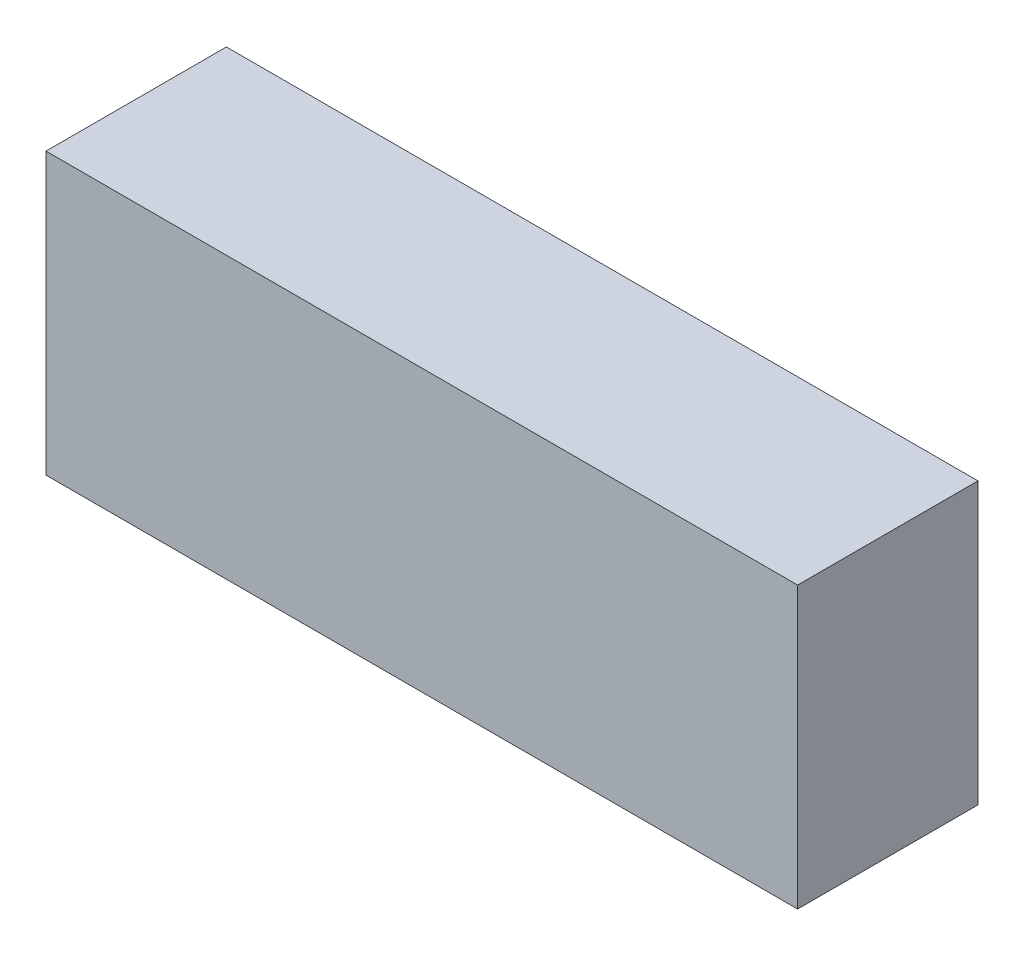
ISO-10303-21;
HEADER;
FILE_DESCRIPTION(('STEP AP214'),'2;1');
FILE_NAME('part.step','',(''),(''),'','','');
FILE_SCHEMA(('AUTOMOTIVE_DESIGN { 1 0 10303 214 1 1 1 1 }'));
ENDSEC;
DATA;
#1=APPLICATION_CONTEXT('core data for automotive mechanical design processes');
#2=APPLICATION_PROTOCOL_DEFINITION('international standard','automotive_design',2000,#1);
#3=PRODUCT_CONTEXT('',#1,'mechanical');
#4=PRODUCT('Part','Part','',(#3));
#5=PRODUCT_RELATED_PRODUCT_CATEGORY('part','',(#4));
#6=PRODUCT_DEFINITION_FORMATION('','',#4);
#7=PRODUCT_DEFINITION_CONTEXT('part definition',#1,'design');
#8=PRODUCT_DEFINITION('design','',#6,#7);
#9=PRODUCT_DEFINITION_SHAPE('','',#8);
#10=(LENGTH_UNIT() NAMED_UNIT(*) SI_UNIT(.MILLI.,.METRE.));
#11=(NAMED_UNIT(*) PLANE_ANGLE_UNIT() SI_UNIT($,.RADIAN.));
#12=(NAMED_UNIT(*) SI_UNIT($,.STERADIAN.) SOLID_ANGLE_UNIT());
#13=UNCERTAINTY_MEASURE_WITH_UNIT(LENGTH_MEASURE(1.E-05),#10,'distance_accuracy_value','');
#14=(GEOMETRIC_REPRESENTATION_CONTEXT(3) GLOBAL_UNCERTAINTY_ASSIGNED_CONTEXT((#13)) GLOBAL_UNIT_ASSIGNED_CONTEXT((#10,
#11,#12)) REPRESENTATION_CONTEXT('',''));
#15=CARTESIAN_POINT('',(0.,0.,0.));
#16=DIRECTION('',(0.,0.,1.));
#17=DIRECTION('',(1.,0.,0.));
#18=AXIS2_PLACEMENT_3D('',#15,#16,#17);
#19=CARTESIAN_POINT('',(-37.5,28.,9.00000000000001));
#20=DIRECTION('',(1.,0.,0.));
#21=DIRECTION('',(0.,0.,-1.));
#22=AXIS2_PLACEMENT_3D('',#19,#20,#21);
#23=PLANE('',#22);
#24=DIRECTION('',(0.,0.,1.));
#25=VECTOR('',#24,1.);
#26=CARTESIAN_POINT('',(-37.5,0.,9.00000000000001));
#27=LINE('',#26,#25);
#28=CARTESIAN_POINT('',(-37.5,0.,-8.99999999999999));
#29=VERTEX_POINT('',#28);
#30=CARTESIAN_POINT('',(-37.5,0.,9.00000000000001));
#31=VERTEX_POINT('',#30);
#32=EDGE_CURVE('E98',#29,#31,#27,.T.);
#33=ORIENTED_EDGE('',*,*,#32,.T.);
#34=DIRECTION('',(0.,-1.,0.));
#35=VECTOR('',#34,1.);
#36=CARTESIAN_POINT('',(-37.5,28.,9.00000000000001));
#37=LINE('',#36,#35);
#38=CARTESIAN_POINT('',(-37.5,28.,9.00000000000001));
#39=VERTEX_POINT('',#38);
#40=EDGE_CURVE('E11',#39,#31,#37,.T.);
#41=ORIENTED_EDGE('',*,*,#40,.F.);
#42=DIRECTION('',(0.,0.,1.));
#43=VECTOR('',#42,1.);
#44=CARTESIAN_POINT('',(-37.5,28.,9.00000000000001));
#45=LINE('',#44,#43);
#46=CARTESIAN_POINT('',(-37.5,28.,-8.99999999999999));
#47=VERTEX_POINT('',#46);
#48=EDGE_CURVE('E86',#47,#39,#45,.T.);
#49=ORIENTED_EDGE('',*,*,#48,.F.);
#50=DIRECTION('',(0.,-1.,0.));
#51=VECTOR('',#50,1.);
#52=CARTESIAN_POINT('',(-37.5,28.,-8.99999999999999));
#53=LINE('',#52,#51);
#54=EDGE_CURVE('E94',#47,#29,#53,.T.);
#55=ORIENTED_EDGE('',*,*,#54,.T.);
#56=EDGE_LOOP('',(#33,#41,#49,#55));
#57=FACE_BOUND('',#56,.T.);
#58=ADVANCED_FACE('F35',(#57),#23,.F.);
#59=CARTESIAN_POINT('',(37.5,28.,9.));
#60=DIRECTION('',(0.,0.,-1.));
#61=DIRECTION('',(-1.,0.,0.));
#62=AXIS2_PLACEMENT_3D('',#59,#60,#61);
#63=PLANE('',#62);
#64=DIRECTION('',(1.,0.,0.));
#65=VECTOR('',#64,1.);
#66=CARTESIAN_POINT('',(37.5,0.,9.));
#67=LINE('',#66,#65);
#68=CARTESIAN_POINT('',(37.5,0.,9.));
#69=VERTEX_POINT('',#68);
#70=EDGE_CURVE('E90',#31,#69,#67,.T.);
#71=ORIENTED_EDGE('',*,*,#70,.T.);
#72=DIRECTION('',(0.,-1.,0.));
#73=VECTOR('',#72,1.);
#74=CARTESIAN_POINT('',(37.5,28.,9.));
#75=LINE('',#74,#73);
#76=CARTESIAN_POINT('',(37.5,28.,9.));
#77=VERTEX_POINT('',#76);
#78=EDGE_CURVE('E43',#77,#69,#75,.T.);
#79=ORIENTED_EDGE('',*,*,#78,.F.);
#80=DIRECTION('',(1.,0.,0.));
#81=VECTOR('',#80,1.);
#82=CARTESIAN_POINT('',(37.5,28.,9.));
#83=LINE('',#82,#81);
#84=EDGE_CURVE('E81',#39,#77,#83,.T.);
#85=ORIENTED_EDGE('',*,*,#84,.F.);
#86=ORIENTED_EDGE('',*,*,#40,.T.);
#87=EDGE_LOOP('',(#71,#79,#85,#86));
#88=FACE_BOUND('',#87,.T.);
#89=ADVANCED_FACE('F89',(#88),#63,.F.);
#90=CARTESIAN_POINT('',(37.5,28.,9.));
#91=DIRECTION('',(-1.,0.,0.));
#92=DIRECTION('',(0.,0.,1.));
#93=AXIS2_PLACEMENT_3D('',#90,#91,#92);
#94=PLANE('',#93);
#95=DIRECTION('',(0.,0.,-1.));
#96=VECTOR('',#95,1.);
#97=CARTESIAN_POINT('',(37.5,0.,9.));
#98=LINE('',#97,#96);
#99=CARTESIAN_POINT('',(37.5,0.,-9.));
#100=VERTEX_POINT('',#99);
#101=EDGE_CURVE('E68',#69,#100,#98,.T.);
#102=ORIENTED_EDGE('',*,*,#101,.T.);
#103=DIRECTION('',(0.,-1.,0.));
#104=VECTOR('',#103,1.);
#105=CARTESIAN_POINT('',(37.5,28.,-9.));
#106=LINE('',#105,#104);
#107=CARTESIAN_POINT('',(37.5,28.,-9.));
#108=VERTEX_POINT('',#107);
#109=EDGE_CURVE('E91',#108,#100,#106,.T.);
#110=ORIENTED_EDGE('',*,*,#109,.F.);
#111=DIRECTION('',(0.,0.,-1.));
#112=VECTOR('',#111,1.);
#113=CARTESIAN_POINT('',(37.5,28.,9.));
#114=LINE('',#113,#112);
#115=EDGE_CURVE('E84',#77,#108,#114,.T.);
#116=ORIENTED_EDGE('',*,*,#115,.F.);
#117=ORIENTED_EDGE('',*,*,#78,.T.);
#118=EDGE_LOOP('',(#102,#110,#116,#117));
#119=FACE_BOUND('',#118,.T.);
#120=ADVANCED_FACE('F92',(#119),#94,.F.);
#121=CARTESIAN_POINT('',(37.5,28.,-9.));
#122=DIRECTION('',(0.,0.,1.));
#123=DIRECTION('',(1.,0.,0.));
#124=AXIS2_PLACEMENT_3D('',#121,#122,#123);
#125=PLANE('',#124);
#126=DIRECTION('',(-1.,0.,0.));
#127=VECTOR('',#126,1.);
#128=CARTESIAN_POINT('',(37.5,0.,-9.));
#129=LINE('',#128,#127);
#130=EDGE_CURVE('E74',#100,#29,#129,.T.);
#131=ORIENTED_EDGE('',*,*,#130,.T.);
#132=ORIENTED_EDGE('',*,*,#54,.F.);
#133=DIRECTION('',(-1.,0.,0.));
#134=VECTOR('',#133,1.);
#135=CARTESIAN_POINT('',(37.5,28.,-9.));
#136=LINE('',#135,#134);
#137=EDGE_CURVE('E51',#108,#47,#136,.T.);
#138=ORIENTED_EDGE('',*,*,#137,.F.);
#139=ORIENTED_EDGE('',*,*,#109,.T.);
#140=EDGE_LOOP('',(#131,#132,#138,#139));
#141=FACE_BOUND('',#140,.T.);
#142=ADVANCED_FACE('F105',(#141),#125,.F.);
#143=CARTESIAN_POINT('',(0.,28.,0.));
#144=DIRECTION('',(0.,1.,0.));
#145=DIRECTION('',(0.,0.,1.));
#146=AXIS2_PLACEMENT_3D('',#143,#144,#145);
#147=PLANE('',#146);
#148=ORIENTED_EDGE('',*,*,#48,.T.);
#149=ORIENTED_EDGE('',*,*,#84,.T.);
#150=ORIENTED_EDGE('',*,*,#115,.T.);
#151=ORIENTED_EDGE('',*,*,#137,.T.);
#152=EDGE_LOOP('',(#148,#149,#150,#151));
#153=FACE_BOUND('',#152,.T.);
#154=ADVANCED_FACE('F82',(#153),#147,.T.);
#155=CARTESIAN_POINT('',(0.,0.,0.));
#156=DIRECTION('',(0.,1.,0.));
#157=DIRECTION('',(0.,0.,1.));
#158=AXIS2_PLACEMENT_3D('',#155,#156,#157);
#159=PLANE('',#158);
#160=ORIENTED_EDGE('',*,*,#32,.F.);
#161=ORIENTED_EDGE('',*,*,#130,.F.);
#162=ORIENTED_EDGE('',*,*,#101,.F.);
#163=ORIENTED_EDGE('',*,*,#70,.F.);
#164=EDGE_LOOP('',(#160,#161,#162,#163));
#165=FACE_BOUND('',#164,.T.);
#166=ADVANCED_FACE('F108',(#165),#159,.F.);
#167=CLOSED_SHELL('',(#58,#89,#120,#142,#154,#166));
#168=MANIFOLD_SOLID_BREP('B2',#167);
#169=ADVANCED_BREP_SHAPE_REPRESENTATION('',(#18,#168),#14);
#170=SHAPE_DEFINITION_REPRESENTATION(#9,#169);
ENDSEC;
END-ISO-10303-21;
